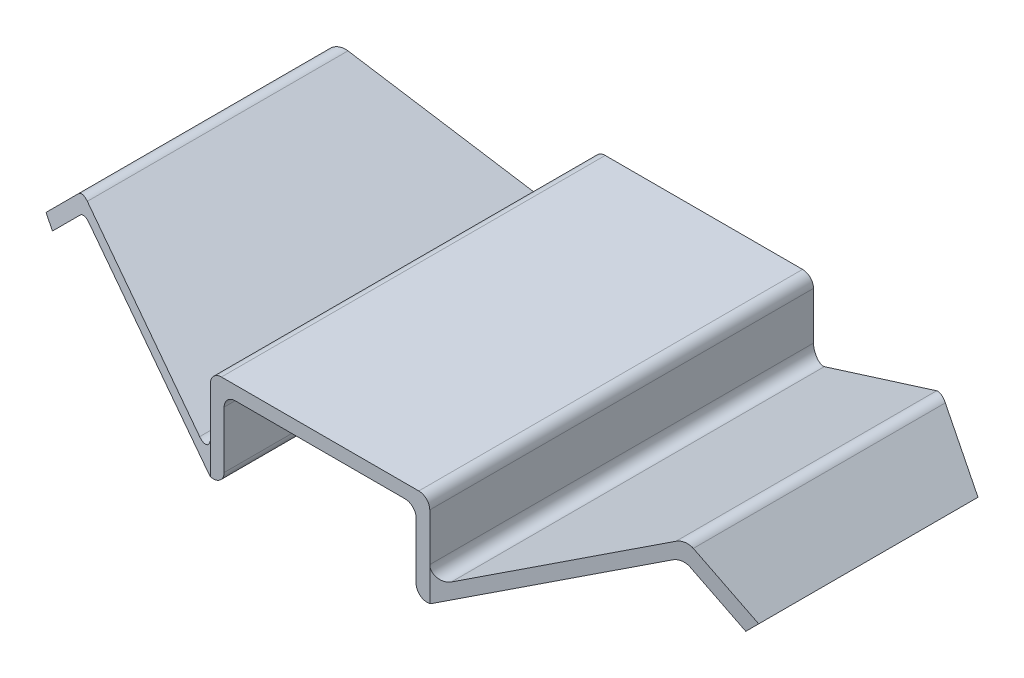
ISO-10303-21;
HEADER;
FILE_DESCRIPTION(('STEP AP214'),'2;1');
FILE_NAME('part.step','',(''),(''),'','','');
FILE_SCHEMA(('AUTOMOTIVE_DESIGN { 1 0 10303 214 1 1 1 1 }'));
ENDSEC;
DATA;
#1=APPLICATION_CONTEXT('core data for automotive mechanical design processes');
#2=APPLICATION_PROTOCOL_DEFINITION('international standard','automotive_design',2000,#1);
#3=PRODUCT_CONTEXT('',#1,'mechanical');
#4=PRODUCT('Part','Part','',(#3));
#5=PRODUCT_RELATED_PRODUCT_CATEGORY('part','',(#4));
#6=PRODUCT_DEFINITION_FORMATION('','',#4);
#7=PRODUCT_DEFINITION_CONTEXT('part definition',#1,'design');
#8=PRODUCT_DEFINITION('design','',#6,#7);
#9=PRODUCT_DEFINITION_SHAPE('','',#8);
#10=(LENGTH_UNIT() NAMED_UNIT(*) SI_UNIT(.MILLI.,.METRE.));
#11=(NAMED_UNIT(*) PLANE_ANGLE_UNIT() SI_UNIT($,.RADIAN.));
#12=(NAMED_UNIT(*) SI_UNIT($,.STERADIAN.) SOLID_ANGLE_UNIT());
#13=UNCERTAINTY_MEASURE_WITH_UNIT(LENGTH_MEASURE(1.E-05),#10,'distance_accuracy_value','');
#14=(GEOMETRIC_REPRESENTATION_CONTEXT(3) GLOBAL_UNCERTAINTY_ASSIGNED_CONTEXT((#13)) GLOBAL_UNIT_ASSIGNED_CONTEXT((#10,
#11,#12)) REPRESENTATION_CONTEXT('',''));
#15=CARTESIAN_POINT('',(0.,0.,0.));
#16=DIRECTION('',(0.,0.,1.));
#17=DIRECTION('',(1.,0.,0.));
#18=AXIS2_PLACEMENT_3D('',#15,#16,#17);
#19=CARTESIAN_POINT('',(0.875,-0.910087912512428,1.75));
#20=DIRECTION('',(-0.477091862904235,0.878853431665694,0.));
#21=DIRECTION('',(-0.878853431665694,-0.477091862904235,0.));
#22=AXIS2_PLACEMENT_3D('',#19,#20,#21);
#23=PLANE('',#22);
#24=DIRECTION('',(-0.843407502480084,-0.457849787060617,0.281135834160028));
#25=VECTOR('',#24,1.);
#26=CARTESIAN_POINT('',(0.884879669656107,-0.904724663270541,1.78837344344796));
#27=LINE('',#26,#25);
#28=CARTESIAN_POINT('',(2.66198723379466,0.0599908715475346,1.19600425540178));
#29=VERTEX_POINT('',#28);
#30=CARTESIAN_POINT('',(1.02270918629042,-0.829902925669055,1.74243027123653));
#31=VERTEX_POINT('',#30);
#32=EDGE_CURVE('E651',#29,#31,#27,.T.);
#33=ORIENTED_EDGE('',*,*,#32,.T.);
#34=DIRECTION('',(0.,0.,-1.));
#35=VECTOR('',#34,1.);
#36=CARTESIAN_POINT('',(1.02270918629042,-0.829902925669055,1.75));
#37=LINE('',#36,#35);
#38=CARTESIAN_POINT('',(1.02270918629042,-0.829902925669055,-1.74243027123653));
#39=VERTEX_POINT('',#38);
#40=EDGE_CURVE('E379',#31,#39,#37,.T.);
#41=ORIENTED_EDGE('',*,*,#40,.T.);
#42=DIRECTION('',(-0.843407502480084,-0.457849787060617,-0.281135834160028));
#43=VECTOR('',#42,1.);
#44=CARTESIAN_POINT('',(1.71477192076908,-0.454211726952068,-1.51174269307697));
#45=LINE('',#44,#43);
#46=CARTESIAN_POINT('',(2.66198723379466,0.0599908715475344,-1.19600425540178));
#47=VERTEX_POINT('',#46);
#48=EDGE_CURVE('E493',#47,#39,#45,.T.);
#49=ORIENTED_EDGE('',*,*,#48,.F.);
#50=DIRECTION('',(0.,0.,-1.));
#51=VECTOR('',#50,1.);
#52=CARTESIAN_POINT('',(2.66198723379466,0.0599908715475346,1.17413029257684));
#53=LINE('',#52,#51);
#54=EDGE_CURVE('E376',#47,#29,#53,.F.);
#55=ORIENTED_EDGE('',*,*,#54,.T.);
#56=EDGE_LOOP('',(#33,#41,#49,#55));
#57=FACE_BOUND('',#56,.T.);
#58=ADVANCED_FACE('F45',(#57),#23,.F.);
#59=CARTESIAN_POINT('',(2.72760912226949,0.0956141824338702,1.75));
#60=DIRECTION('',(0.707106781186548,0.707106781186548,0.));
#61=DIRECTION('',(-0.707106781186548,0.707106781186548,0.));
#62=AXIS2_PLACEMENT_3D('',#59,#60,#61);
#63=PLANE('',#62);
#64=DIRECTION('',(-0.688247201611685,0.688247201611685,0.229415733870562));
#65=VECTOR('',#64,1.);
#66=CARTESIAN_POINT('',(2.63668232636057,0.186540978342791,1.20443922454648));
#67=LINE('',#66,#65);
#68=CARTESIAN_POINT('',(3.16161165235168,-0.338388347648318,1.02946278254944));
#69=VERTEX_POINT('',#68);
#70=CARTESIAN_POINT('',(2.78040709820374,0.0428162064996204,1.15653096726542));
#71=VERTEX_POINT('',#70);
#72=EDGE_CURVE('E257',#69,#71,#67,.T.);
#73=ORIENTED_EDGE('',*,*,#72,.T.);
#74=DIRECTION('',(0.,0.,-1.));
#75=VECTOR('',#74,1.);
#76=CARTESIAN_POINT('',(2.78040709820374,0.0428162064996203,-1.17413029257684));
#77=LINE('',#76,#75);
#78=CARTESIAN_POINT('',(2.78040709820374,0.0428162064996203,-1.15653096726542));
#79=VERTEX_POINT('',#78);
#80=EDGE_CURVE('E414',#71,#79,#77,.T.);
#81=ORIENTED_EDGE('',*,*,#80,.T.);
#82=DIRECTION('',(-0.688247201611685,0.688247201611685,-0.229415733870562));
#83=VECTOR('',#82,1.);
#84=CARTESIAN_POINT('',(3.18931390530794,-0.366090600604578,-1.02022869823069));
#85=LINE('',#84,#83);
#86=CARTESIAN_POINT('',(3.16161165235168,-0.338388347648318,-1.02946278254944));
#87=VERTEX_POINT('',#86);
#88=EDGE_CURVE('E500',#87,#79,#85,.T.);
#89=ORIENTED_EDGE('',*,*,#88,.F.);
#90=DIRECTION('',(0.,0.,-1.));
#91=VECTOR('',#90,1.);
#92=CARTESIAN_POINT('',(3.16161165235168,-0.338388347648318,1.75));
#93=LINE('',#92,#91);
#94=EDGE_CURVE('E266',#69,#87,#93,.T.);
#95=ORIENTED_EDGE('',*,*,#94,.F.);
#96=EDGE_LOOP('',(#73,#81,#89,#95));
#97=FACE_BOUND('',#96,.T.);
#98=ADVANCED_FACE('F669',(#97),#63,.F.);
#99=CARTESIAN_POINT('',(3.16161165235168,-0.338388347648318,1.75));
#100=DIRECTION('',(-0.707106781186547,0.707106781186548,0.));
#101=DIRECTION('',(-0.707106781186548,-0.707106781186547,0.));
#102=AXIS2_PLACEMENT_3D('',#99,#100,#101);
#103=PLANE('',#102);
#104=DIRECTION('',(0.,0.,-1.));
#105=VECTOR('',#104,1.);
#106=CARTESIAN_POINT('',(3.25,-0.249999999999999,1.75));
#107=LINE('',#106,#105);
#108=CARTESIAN_POINT('',(3.25,-0.249999999999999,1.));
#109=VERTEX_POINT('',#108);
#110=CARTESIAN_POINT('',(3.25,-0.249999999999999,-1.));
#111=VERTEX_POINT('',#110);
#112=EDGE_CURVE('E243',#109,#111,#107,.T.);
#113=ORIENTED_EDGE('',*,*,#112,.F.);
#114=DIRECTION('',(-0.688247201611686,-0.688247201611685,0.229415733870562));
#115=VECTOR('',#114,1.);
#116=CARTESIAN_POINT('',(3.04784261801738,-0.452157381982617,1.06738579399421));
#117=LINE('',#116,#115);
#118=EDGE_CURVE('E250',#109,#69,#117,.T.);
#119=ORIENTED_EDGE('',*,*,#118,.T.);
#120=ORIENTED_EDGE('',*,*,#94,.T.);
#121=DIRECTION('',(-0.688247201611686,-0.688247201611685,-0.229415733870562));
#122=VECTOR('',#121,1.);
#123=CARTESIAN_POINT('',(3.60047419696475,0.100474196964752,-0.883175267678416));
#124=LINE('',#123,#122);
#125=EDGE_CURVE('E264',#111,#87,#124,.T.);
#126=ORIENTED_EDGE('',*,*,#125,.F.);
#127=EDGE_LOOP('',(#113,#119,#120,#126));
#128=FACE_BOUND('',#127,.T.);
#129=ADVANCED_FACE('F262',(#128),#103,.F.);
#130=CARTESIAN_POINT('',(2.75,0.250000000000001,1.75));
#131=DIRECTION('',(-0.707106781186547,-0.707106781186548,0.));
#132=DIRECTION('',(0.707106781186548,-0.707106781186547,0.));
#133=AXIS2_PLACEMENT_3D('',#130,#131,#132);
#134=PLANE('',#133);
#135=DIRECTION('',(0.688247201611686,-0.688247201611685,0.229415733870562));
#136=VECTOR('',#135,1.);
#137=CARTESIAN_POINT('',(3.21052631578947,-0.210526315789473,-1.01315789473684));
#138=LINE('',#137,#136);
#139=CARTESIAN_POINT('',(2.80279797593425,0.197202024065751,-1.14906734135525));
#140=VERTEX_POINT('',#139);
#141=EDGE_CURVE('E658',#140,#111,#138,.T.);
#142=ORIENTED_EDGE('',*,*,#141,.F.);
#143=DIRECTION('',(0.,0.,-1.));
#144=VECTOR('',#143,1.);
#145=CARTESIAN_POINT('',(2.80279797593425,0.197202024065751,1.75));
#146=LINE('',#145,#144);
#147=CARTESIAN_POINT('',(2.80279797593425,0.197202024065751,1.14906734135525));
#148=VERTEX_POINT('',#147);
#149=EDGE_CURVE('E246',#140,#148,#146,.F.);
#150=ORIENTED_EDGE('',*,*,#149,.T.);
#151=DIRECTION('',(0.688247201611686,-0.688247201611685,-0.229415733870562));
#152=VECTOR('',#151,1.);
#153=CARTESIAN_POINT('',(2.65789473684211,0.342105263157895,1.19736842105263));
#154=LINE('',#153,#152);
#155=EDGE_CURVE('E238',#148,#109,#154,.T.);
#156=ORIENTED_EDGE('',*,*,#155,.T.);
#157=ORIENTED_EDGE('',*,*,#112,.T.);
#158=EDGE_LOOP('',(#142,#150,#156,#157));
#159=FACE_BOUND('',#158,.T.);
#160=ADVANCED_FACE('F241',(#159),#134,.F.);
#161=CARTESIAN_POINT('',(1.,-0.7,1.75));
#162=DIRECTION('',(0.477091862904234,-0.878853431665694,0.));
#163=DIRECTION('',(0.878853431665694,0.477091862904234,0.));
#164=AXIS2_PLACEMENT_3D('',#161,#162,#163);
#165=PLANE('',#164);
#166=DIRECTION('',(0.843407502480084,0.457849787060617,0.281135834160028));
#167=VECTOR('',#166,1.);
#168=CARTESIAN_POINT('',(1.82989225111298,-0.249487063681527,-1.47336924962901));
#169=LINE('',#168,#167);
#170=CARTESIAN_POINT('',(1.14770918629042,-0.619815013156627,-1.70076360456986));
#171=VERTEX_POINT('',#170);
#172=CARTESIAN_POINT('',(2.68437811152517,0.214376689113665,-1.18854062949161));
#173=VERTEX_POINT('',#172);
#174=EDGE_CURVE('E654',#171,#173,#169,.T.);
#175=ORIENTED_EDGE('',*,*,#174,.F.);
#176=DIRECTION('',(0.,0.,-1.));
#177=VECTOR('',#176,1.);
#178=CARTESIAN_POINT('',(1.14770918629042,-0.619815013156627,1.75));
#179=LINE('',#178,#177);
#180=CARTESIAN_POINT('',(1.14770918629042,-0.619815013156627,1.70076360456986));
#181=VERTEX_POINT('',#180);
#182=EDGE_CURVE('E306',#171,#181,#179,.F.);
#183=ORIENTED_EDGE('',*,*,#182,.T.);
#184=DIRECTION('',(0.843407502480084,0.457849787060617,-0.281135834160028));
#185=VECTOR('',#184,1.);
#186=CARTESIAN_POINT('',(1.,-0.7,1.75));
#187=LINE('',#186,#185);
#188=CARTESIAN_POINT('',(2.68437811152517,0.214376689113665,1.18854062949161));
#189=VERTEX_POINT('',#188);
#190=EDGE_CURVE('E251',#181,#189,#187,.T.);
#191=ORIENTED_EDGE('',*,*,#190,.T.);
#192=DIRECTION('',(0.,0.,-1.));
#193=VECTOR('',#192,1.);
#194=CARTESIAN_POINT('',(2.68437811152517,0.214376689113665,1.75));
#195=LINE('',#194,#193);
#196=EDGE_CURVE('E302',#189,#173,#195,.T.);
#197=ORIENTED_EDGE('',*,*,#196,.T.);
#198=EDGE_LOOP('',(#175,#183,#191,#197));
#199=FACE_BOUND('',#198,.T.);
#200=ADVANCED_FACE('F688',(#199),#165,.F.);
#201=CARTESIAN_POINT('',(0.,0.,-1.75));
#202=DIRECTION('',(0.,0.,1.));
#203=DIRECTION('',(1.,0.,0.));
#204=AXIS2_PLACEMENT_3D('',#201,#202,#203);
#205=PLANE('',#204);
#206=DIRECTION('',(-1.,0.,0.));
#207=VECTOR('',#206,1.);
#208=CARTESIAN_POINT('',(-1.,0.,-1.75));
#209=LINE('',#208,#207);
#210=CARTESIAN_POINT('',(0.9,0.,-1.75));
#211=VERTEX_POINT('',#210);
#212=CARTESIAN_POINT('',(-0.9,0.,-1.75));
#213=VERTEX_POINT('',#212);
#214=EDGE_CURVE('E277',#211,#213,#209,.T.);
#215=ORIENTED_EDGE('',*,*,#214,.F.);
#216=CARTESIAN_POINT('',(0.9,-0.0999999999999998,-1.75));
#217=DIRECTION('',(0.,0.,1.));
#218=DIRECTION('',(1.,0.,0.));
#219=AXIS2_PLACEMENT_3D('',#216,#217,#218);
#220=CIRCLE('',#219,0.1);
#221=CARTESIAN_POINT('',(1.,-0.0999999999999998,-1.75));
#222=VERTEX_POINT('',#221);
#223=EDGE_CURVE('E340',#211,#222,#220,.F.);
#224=ORIENTED_EDGE('',*,*,#223,.T.);
#225=DIRECTION('',(0.,1.,0.));
#226=VECTOR('',#225,1.);
#227=CARTESIAN_POINT('',(1.,0.,-1.75));
#228=LINE('',#227,#226);
#229=CARTESIAN_POINT('',(1.,-0.531929669990057,-1.75));
#230=VERTEX_POINT('',#229);
#231=EDGE_CURVE('E557',#230,#222,#228,.T.);
#232=ORIENTED_EDGE('',*,*,#231,.F.);
#233=DIRECTION('',(0.,1.,0.));
#234=VECTOR('',#233,1.);
#235=CARTESIAN_POINT('',(1.,0.,-1.75));
#236=LINE('',#235,#234);
#237=CARTESIAN_POINT('',(1.,-0.838842166157671,-1.75));
#238=VERTEX_POINT('',#237);
#239=EDGE_CURVE('E292',#238,#230,#236,.T.);
#240=ORIENTED_EDGE('',*,*,#239,.F.);
#241=CARTESIAN_POINT('',(0.975,-0.742017582502486,-1.75));
#242=DIRECTION('',(0.,0.,1.));
#243=DIRECTION('',(1.,0.,0.));
#244=AXIS2_PLACEMENT_3D('',#241,#242,#243);
#245=CIRCLE('',#244,0.1);
#246=CARTESIAN_POINT('',(0.875,-0.742017582502486,-1.75));
#247=VERTEX_POINT('',#246);
#248=EDGE_CURVE('E334',#238,#247,#245,.F.);
#249=ORIENTED_EDGE('',*,*,#248,.T.);
#250=DIRECTION('',(0.,-1.,0.));
#251=VECTOR('',#250,1.);
#252=CARTESIAN_POINT('',(0.875,-0.125,-1.75));
#253=LINE('',#252,#251);
#254=CARTESIAN_POINT('',(0.875,-0.225,-1.75));
#255=VERTEX_POINT('',#254);
#256=EDGE_CURVE('E554',#255,#247,#253,.T.);
#257=ORIENTED_EDGE('',*,*,#256,.F.);
#258=CARTESIAN_POINT('',(0.775,-0.225,-1.75));
#259=DIRECTION('',(0.,0.,1.));
#260=DIRECTION('',(1.,0.,0.));
#261=AXIS2_PLACEMENT_3D('',#258,#259,#260);
#262=CIRCLE('',#261,0.1);
#263=CARTESIAN_POINT('',(0.775,-0.125,-1.75));
#264=VERTEX_POINT('',#263);
#265=EDGE_CURVE('E441',#255,#264,#262,.T.);
#266=ORIENTED_EDGE('',*,*,#265,.T.);
#267=DIRECTION('',(1.,0.,0.));
#268=VECTOR('',#267,1.);
#269=CARTESIAN_POINT('',(-0.875,-0.125,-1.75));
#270=LINE('',#269,#268);
#271=CARTESIAN_POINT('',(-0.775,-0.125,-1.75));
#272=VERTEX_POINT('',#271);
#273=EDGE_CURVE('E550',#272,#264,#270,.T.);
#274=ORIENTED_EDGE('',*,*,#273,.F.);
#275=CARTESIAN_POINT('',(-0.775,-0.225,-1.75));
#276=DIRECTION('',(0.,0.,1.));
#277=DIRECTION('',(1.,0.,0.));
#278=AXIS2_PLACEMENT_3D('',#275,#276,#277);
#279=CIRCLE('',#278,0.1);
#280=CARTESIAN_POINT('',(-0.875,-0.225,-1.75));
#281=VERTEX_POINT('',#280);
#282=EDGE_CURVE('E447',#272,#281,#279,.T.);
#283=ORIENTED_EDGE('',*,*,#282,.T.);
#284=DIRECTION('',(0.,1.,0.));
#285=VECTOR('',#284,1.);
#286=CARTESIAN_POINT('',(-0.875,-0.125,-1.75));
#287=LINE('',#286,#285);
#288=CARTESIAN_POINT('',(-0.875,-0.742017582502486,-1.75));
#289=VERTEX_POINT('',#288);
#290=EDGE_CURVE('E546',#289,#281,#287,.T.);
#291=ORIENTED_EDGE('',*,*,#290,.F.);
#292=CARTESIAN_POINT('',(-0.975,-0.742017582502486,-1.75));
#293=DIRECTION('',(0.,0.,1.));
#294=DIRECTION('',(1.,0.,0.));
#295=AXIS2_PLACEMENT_3D('',#292,#293,#294);
#296=CIRCLE('',#295,0.1);
#297=CARTESIAN_POINT('',(-1.,-0.83884216615767,-1.75));
#298=VERTEX_POINT('',#297);
#299=EDGE_CURVE('E331',#289,#298,#296,.F.);
#300=ORIENTED_EDGE('',*,*,#299,.T.);
#301=DIRECTION('',(0.,1.,0.));
#302=VECTOR('',#301,1.);
#303=CARTESIAN_POINT('',(-1.,0.,-1.75));
#304=LINE('',#303,#302);
#305=CARTESIAN_POINT('',(-1.,-0.531929669990058,-1.75));
#306=VERTEX_POINT('',#305);
#307=EDGE_CURVE('E62',#298,#306,#304,.T.);
#308=ORIENTED_EDGE('',*,*,#307,.T.);
#309=DIRECTION('',(0.,-1.,0.));
#310=VECTOR('',#309,1.);
#311=CARTESIAN_POINT('',(-1.,0.,-1.75));
#312=LINE('',#311,#310);
#313=CARTESIAN_POINT('',(-1.,-0.1,-1.75));
#314=VERTEX_POINT('',#313);
#315=EDGE_CURVE('E524',#314,#306,#312,.T.);
#316=ORIENTED_EDGE('',*,*,#315,.F.);
#317=CARTESIAN_POINT('',(-0.9,-0.1,-1.75));
#318=DIRECTION('',(0.,0.,1.));
#319=DIRECTION('',(1.,0.,0.));
#320=AXIS2_PLACEMENT_3D('',#317,#318,#319);
#321=CIRCLE('',#320,0.1);
#322=EDGE_CURVE('E337',#314,#213,#321,.F.);
#323=ORIENTED_EDGE('',*,*,#322,.T.);
#324=EDGE_LOOP('',(#215,#224,#232,#240,#249,#257,#266,#274,#283,#291,#300,#308,#316,#323));
#325=FACE_BOUND('',#324,.T.);
#326=ADVANCED_FACE('F678',(#325),#205,.F.);
#327=CARTESIAN_POINT('',(-1.,-0.7,1.75));
#328=DIRECTION('',(-0.477091862904234,-0.878853431665694,0.));
#329=DIRECTION('',(0.878853431665694,-0.477091862904234,0.));
#330=AXIS2_PLACEMENT_3D('',#327,#328,#329);
#331=PLANE('',#330);
#332=DIRECTION('',(-0.843407502480084,0.457849787060617,-0.281135834160028));
#333=VECTOR('',#332,1.);
#334=CARTESIAN_POINT('',(-1.,-0.7,1.75));
#335=LINE('',#334,#333);
#336=CARTESIAN_POINT('',(-1.14770918629042,-0.619815013156627,1.70076360456986));
#337=VERTEX_POINT('',#336);
#338=CARTESIAN_POINT('',(-2.68437811152517,0.214376689113665,1.18854062949161));
#339=VERTEX_POINT('',#338);
#340=EDGE_CURVE('E509',#337,#339,#335,.T.);
#341=ORIENTED_EDGE('',*,*,#340,.F.);
#342=DIRECTION('',(0.,0.,-1.));
#343=VECTOR('',#342,1.);
#344=CARTESIAN_POINT('',(-1.14770918629042,-0.619815013156627,-1.75));
#345=LINE('',#344,#343);
#346=CARTESIAN_POINT('',(-1.14770918629042,-0.619815013156627,-1.70076360456986));
#347=VERTEX_POINT('',#346);
#348=EDGE_CURVE('E312',#337,#347,#345,.T.);
#349=ORIENTED_EDGE('',*,*,#348,.T.);
#350=DIRECTION('',(-0.843407502480084,0.457849787060617,0.281135834160028));
#351=VECTOR('',#350,1.);
#352=CARTESIAN_POINT('',(-1.82989225111298,-0.249487063681528,-1.47336924962901));
#353=LINE('',#352,#351);
#354=CARTESIAN_POINT('',(-2.68437811152517,0.214376689113665,-1.18854062949161));
#355=VERTEX_POINT('',#354);
#356=EDGE_CURVE('E520',#347,#355,#353,.T.);
#357=ORIENTED_EDGE('',*,*,#356,.T.);
#358=DIRECTION('',(0.,0.,-1.));
#359=VECTOR('',#358,1.);
#360=CARTESIAN_POINT('',(-2.68437811152517,0.214376689113665,1.75));
#361=LINE('',#360,#359);
#362=EDGE_CURVE('E309',#355,#339,#361,.F.);
#363=ORIENTED_EDGE('',*,*,#362,.T.);
#364=EDGE_LOOP('',(#341,#349,#357,#363));
#365=FACE_BOUND('',#364,.T.);
#366=ADVANCED_FACE('F589',(#365),#331,.F.);
#367=CARTESIAN_POINT('',(-2.75,0.25,1.75));
#368=DIRECTION('',(0.707106781186547,-0.707106781186547,0.));
#369=DIRECTION('',(0.707106781186548,0.707106781186548,0.));
#370=AXIS2_PLACEMENT_3D('',#367,#368,#369);
#371=PLANE('',#370);
#372=DIRECTION('',(-0.688247201611685,-0.688247201611685,-0.229415733870562));
#373=VECTOR('',#372,1.);
#374=CARTESIAN_POINT('',(-2.65789473684211,0.342105263157895,1.19736842105263));
#375=LINE('',#374,#373);
#376=CARTESIAN_POINT('',(-2.80279797593425,0.19720202406575,1.14906734135525));
#377=VERTEX_POINT('',#376);
#378=CARTESIAN_POINT('',(-3.25,-0.25,1.));
#379=VERTEX_POINT('',#378);
#380=EDGE_CURVE('E506',#377,#379,#375,.T.);
#381=ORIENTED_EDGE('',*,*,#380,.F.);
#382=DIRECTION('',(0.,0.,-1.));
#383=VECTOR('',#382,1.);
#384=CARTESIAN_POINT('',(-2.80279797593425,0.19720202406575,1.75));
#385=LINE('',#384,#383);
#386=CARTESIAN_POINT('',(-2.80279797593425,0.19720202406575,-1.14906734135525));
#387=VERTEX_POINT('',#386);
#388=EDGE_CURVE('E423',#377,#387,#385,.T.);
#389=ORIENTED_EDGE('',*,*,#388,.T.);
#390=DIRECTION('',(-0.688247201611685,-0.688247201611685,0.229415733870562));
#391=VECTOR('',#390,1.);
#392=CARTESIAN_POINT('',(-3.21052631578947,-0.210526315789474,-1.01315789473684));
#393=LINE('',#392,#391);
#394=CARTESIAN_POINT('',(-3.25,-0.250000000000001,-1.));
#395=VERTEX_POINT('',#394);
#396=EDGE_CURVE('E517',#387,#395,#393,.T.);
#397=ORIENTED_EDGE('',*,*,#396,.T.);
#398=DIRECTION('',(0.,0.,-1.));
#399=VECTOR('',#398,1.);
#400=CARTESIAN_POINT('',(-3.25,-0.25,1.75));
#401=LINE('',#400,#399);
#402=EDGE_CURVE('E282',#379,#395,#401,.T.);
#403=ORIENTED_EDGE('',*,*,#402,.F.);
#404=EDGE_LOOP('',(#381,#389,#397,#403));
#405=FACE_BOUND('',#404,.T.);
#406=ADVANCED_FACE('F598',(#405),#371,.F.);
#407=CARTESIAN_POINT('',(-3.25,-0.25,1.75));
#408=DIRECTION('',(0.707106781186546,0.707106781186549,0.));
#409=DIRECTION('',(-0.707106781186549,0.707106781186546,0.));
#410=AXIS2_PLACEMENT_3D('',#407,#408,#409);
#411=PLANE('',#410);
#412=DIRECTION('',(0.688247201611687,-0.688247201611684,0.229415733870562));
#413=VECTOR('',#412,1.);
#414=CARTESIAN_POINT('',(-3.13157894736842,-0.368421052631579,1.03947368421053));
#415=LINE('',#414,#413);
#416=CARTESIAN_POINT('',(-3.16161165235168,-0.338388347648318,1.02946278254944));
#417=VERTEX_POINT('',#416);
#418=EDGE_CURVE('E497',#379,#417,#415,.T.);
#419=ORIENTED_EDGE('',*,*,#418,.F.);
#420=ORIENTED_EDGE('',*,*,#402,.T.);
#421=DIRECTION('',(0.688247201611687,-0.688247201611684,-0.229415733870562));
#422=VECTOR('',#421,1.);
#423=CARTESIAN_POINT('',(-3.68421052631579,0.18421052631579,-0.855263157894736));
#424=LINE('',#423,#422);
#425=CARTESIAN_POINT('',(-3.16161165235168,-0.338388347648318,-1.02946278254944));
#426=VERTEX_POINT('',#425);
#427=EDGE_CURVE('E478',#395,#426,#424,.T.);
#428=ORIENTED_EDGE('',*,*,#427,.T.);
#429=DIRECTION('',(0.,0.,-1.));
#430=VECTOR('',#429,1.);
#431=CARTESIAN_POINT('',(-3.16161165235168,-0.338388347648318,1.75));
#432=LINE('',#431,#430);
#433=EDGE_CURVE('E271',#417,#426,#432,.T.);
#434=ORIENTED_EDGE('',*,*,#433,.F.);
#435=EDGE_LOOP('',(#419,#420,#428,#434));
#436=FACE_BOUND('',#435,.T.);
#437=ADVANCED_FACE('F601',(#436),#411,.F.);
#438=CARTESIAN_POINT('',(-2.72760912226949,0.0956141824338692,1.75));
#439=DIRECTION('',(-0.707106781186548,0.707106781186548,0.));
#440=DIRECTION('',(-0.707106781186548,-0.707106781186547,0.));
#441=AXIS2_PLACEMENT_3D('',#438,#439,#440);
#442=PLANE('',#441);
#443=DIRECTION('',(0.688247201611685,0.688247201611685,-0.229415733870562));
#444=VECTOR('',#443,1.);
#445=CARTESIAN_POINT('',(-3.18931390530794,-0.366090600604579,-1.02022869823069));
#446=LINE('',#445,#444);
#447=CARTESIAN_POINT('',(-2.78040709820374,0.0428162064996192,-1.15653096726542));
#448=VERTEX_POINT('',#447);
#449=EDGE_CURVE('E465',#426,#448,#446,.T.);
#450=ORIENTED_EDGE('',*,*,#449,.T.);
#451=DIRECTION('',(0.,0.,-1.));
#452=VECTOR('',#451,1.);
#453=CARTESIAN_POINT('',(-2.78040709820374,0.0428162064996193,1.17413029257684));
#454=LINE('',#453,#452);
#455=CARTESIAN_POINT('',(-2.78040709820374,0.0428162064996193,1.15653096726542));
#456=VERTEX_POINT('',#455);
#457=EDGE_CURVE('E418',#448,#456,#454,.F.);
#458=ORIENTED_EDGE('',*,*,#457,.T.);
#459=DIRECTION('',(0.688247201611685,0.688247201611685,0.229415733870562));
#460=VECTOR('',#459,1.);
#461=CARTESIAN_POINT('',(-2.63668232636057,0.18654097834279,1.20443922454648));
#462=LINE('',#461,#460);
#463=EDGE_CURVE('E488',#417,#456,#462,.T.);
#464=ORIENTED_EDGE('',*,*,#463,.F.);
#465=ORIENTED_EDGE('',*,*,#433,.T.);
#466=EDGE_LOOP('',(#450,#458,#464,#465));
#467=FACE_BOUND('',#466,.T.);
#468=ADVANCED_FACE('F473',(#467),#442,.F.);
#469=CARTESIAN_POINT('',(-0.875,-0.910087912512428,1.75));
#470=DIRECTION('',(0.477091862904234,0.878853431665694,0.));
#471=DIRECTION('',(-0.878853431665694,0.477091862904234,0.));
#472=AXIS2_PLACEMENT_3D('',#469,#470,#471);
#473=PLANE('',#472);
#474=DIRECTION('',(0.843407502480084,-0.457849787060617,-0.281135834160028));
#475=VECTOR('',#474,1.);
#476=CARTESIAN_POINT('',(-1.71477192076908,-0.454211726952069,-1.51174269307697));
#477=LINE('',#476,#475);
#478=CARTESIAN_POINT('',(-2.66198723379467,0.0599908715475337,-1.19600425540178));
#479=VERTEX_POINT('',#478);
#480=CARTESIAN_POINT('',(-1.02270918629042,-0.829902925669055,-1.74243027123653));
#481=VERTEX_POINT('',#480);
#482=EDGE_CURVE('E468',#479,#481,#477,.T.);
#483=ORIENTED_EDGE('',*,*,#482,.T.);
#484=DIRECTION('',(0.,0.,-1.));
#485=VECTOR('',#484,1.);
#486=CARTESIAN_POINT('',(-1.02270918629042,-0.829902925669055,1.75));
#487=LINE('',#486,#485);
#488=CARTESIAN_POINT('',(-1.02270918629042,-0.829902925669055,1.74243027123653));
#489=VERTEX_POINT('',#488);
#490=EDGE_CURVE('E405',#481,#489,#487,.F.);
#491=ORIENTED_EDGE('',*,*,#490,.T.);
#492=DIRECTION('',(0.843407502480084,-0.457849787060617,0.281135834160028));
#493=VECTOR('',#492,1.);
#494=CARTESIAN_POINT('',(-0.884879669656107,-0.904724663270541,1.78837344344796));
#495=LINE('',#494,#493);
#496=CARTESIAN_POINT('',(-2.66198723379466,0.0599908715475336,1.19600425540178));
#497=VERTEX_POINT('',#496);
#498=EDGE_CURVE('E486',#497,#489,#495,.T.);
#499=ORIENTED_EDGE('',*,*,#498,.F.);
#500=DIRECTION('',(0.,0.,-1.));
#501=VECTOR('',#500,1.);
#502=CARTESIAN_POINT('',(-2.66198723379467,0.0599908715475337,-1.17413029257683));
#503=LINE('',#502,#501);
#504=EDGE_CURVE('E401',#497,#479,#503,.T.);
#505=ORIENTED_EDGE('',*,*,#504,.T.);
#506=EDGE_LOOP('',(#483,#491,#499,#505));
#507=FACE_BOUND('',#506,.T.);
#508=ADVANCED_FACE('F490',(#507),#473,.F.);
#509=CARTESIAN_POINT('',(0.,0.,1.75));
#510=DIRECTION('',(0.,0.,1.));
#511=DIRECTION('',(1.,0.,0.));
#512=AXIS2_PLACEMENT_3D('',#509,#510,#511);
#513=PLANE('',#512);
#514=DIRECTION('',(0.,1.,0.));
#515=VECTOR('',#514,1.);
#516=CARTESIAN_POINT('',(1.,0.,1.75));
#517=LINE('',#516,#515);
#518=CARTESIAN_POINT('',(1.,-0.531929669990057,1.75));
#519=VERTEX_POINT('',#518);
#520=CARTESIAN_POINT('',(1.,-0.0999999999999998,1.75));
#521=VERTEX_POINT('',#520);
#522=EDGE_CURVE('E274',#519,#521,#517,.T.);
#523=ORIENTED_EDGE('',*,*,#522,.T.);
#524=CARTESIAN_POINT('',(0.9,-0.0999999999999998,1.75));
#525=DIRECTION('',(0.,0.,1.));
#526=DIRECTION('',(1.,0.,0.));
#527=AXIS2_PLACEMENT_3D('',#524,#525,#526);
#528=CIRCLE('',#527,0.1);
#529=CARTESIAN_POINT('',(0.9,0.,1.75));
#530=VERTEX_POINT('',#529);
#531=EDGE_CURVE('E352',#521,#530,#528,.T.);
#532=ORIENTED_EDGE('',*,*,#531,.T.);
#533=DIRECTION('',(-1.,0.,0.));
#534=VECTOR('',#533,1.);
#535=CARTESIAN_POINT('',(-1.,0.,1.75));
#536=LINE('',#535,#534);
#537=CARTESIAN_POINT('',(-0.9,0.,1.75));
#538=VERTEX_POINT('',#537);
#539=EDGE_CURVE('E267',#530,#538,#536,.T.);
#540=ORIENTED_EDGE('',*,*,#539,.T.);
#541=CARTESIAN_POINT('',(-0.9,-0.1,1.75));
#542=DIRECTION('',(0.,0.,1.));
#543=DIRECTION('',(1.,0.,0.));
#544=AXIS2_PLACEMENT_3D('',#541,#542,#543);
#545=CIRCLE('',#544,0.1);
#546=CARTESIAN_POINT('',(-1.,-0.1,1.75));
#547=VERTEX_POINT('',#546);
#548=EDGE_CURVE('E349',#538,#547,#545,.T.);
#549=ORIENTED_EDGE('',*,*,#548,.T.);
#550=DIRECTION('',(0.,-1.,0.));
#551=VECTOR('',#550,1.);
#552=CARTESIAN_POINT('',(-1.,0.,1.75));
#553=LINE('',#552,#551);
#554=CARTESIAN_POINT('',(-1.,-0.531929669990058,1.75));
#555=VERTEX_POINT('',#554);
#556=EDGE_CURVE('E525',#547,#555,#553,.T.);
#557=ORIENTED_EDGE('',*,*,#556,.T.);
#558=DIRECTION('',(0.,-1.,0.));
#559=VECTOR('',#558,1.);
#560=CARTESIAN_POINT('',(-1.,0.,1.75));
#561=LINE('',#560,#559);
#562=CARTESIAN_POINT('',(-1.,-0.83884216615767,1.75));
#563=VERTEX_POINT('',#562);
#564=EDGE_CURVE('E288',#555,#563,#561,.T.);
#565=ORIENTED_EDGE('',*,*,#564,.T.);
#566=CARTESIAN_POINT('',(-0.975,-0.742017582502486,1.75));
#567=DIRECTION('',(0.,0.,1.));
#568=DIRECTION('',(1.,0.,0.));
#569=AXIS2_PLACEMENT_3D('',#566,#567,#568);
#570=CIRCLE('',#569,0.1);
#571=CARTESIAN_POINT('',(-0.875,-0.742017582502486,1.75));
#572=VERTEX_POINT('',#571);
#573=EDGE_CURVE('E343',#563,#572,#570,.T.);
#574=ORIENTED_EDGE('',*,*,#573,.T.);
#575=DIRECTION('',(0.,1.,0.));
#576=VECTOR('',#575,1.);
#577=CARTESIAN_POINT('',(-0.875,-0.125,1.75));
#578=LINE('',#577,#576);
#579=CARTESIAN_POINT('',(-0.875,-0.225,1.75));
#580=VERTEX_POINT('',#579);
#581=EDGE_CURVE('E529',#572,#580,#578,.T.);
#582=ORIENTED_EDGE('',*,*,#581,.T.);
#583=CARTESIAN_POINT('',(-0.775,-0.225,1.75));
#584=DIRECTION('',(0.,0.,1.));
#585=DIRECTION('',(1.,0.,0.));
#586=AXIS2_PLACEMENT_3D('',#583,#584,#585);
#587=CIRCLE('',#586,0.1);
#588=CARTESIAN_POINT('',(-0.775,-0.125,1.75));
#589=VERTEX_POINT('',#588);
#590=EDGE_CURVE('E450',#580,#589,#587,.F.);
#591=ORIENTED_EDGE('',*,*,#590,.T.);
#592=DIRECTION('',(1.,0.,0.));
#593=VECTOR('',#592,1.);
#594=CARTESIAN_POINT('',(-0.875,-0.125,1.75));
#595=LINE('',#594,#593);
#596=CARTESIAN_POINT('',(0.775,-0.125,1.75));
#597=VERTEX_POINT('',#596);
#598=EDGE_CURVE('E533',#589,#597,#595,.T.);
#599=ORIENTED_EDGE('',*,*,#598,.T.);
#600=CARTESIAN_POINT('',(0.775,-0.225,1.75));
#601=DIRECTION('',(0.,0.,1.));
#602=DIRECTION('',(1.,0.,0.));
#603=AXIS2_PLACEMENT_3D('',#600,#601,#602);
#604=CIRCLE('',#603,0.1);
#605=CARTESIAN_POINT('',(0.875,-0.225,1.75));
#606=VERTEX_POINT('',#605);
#607=EDGE_CURVE('E444',#597,#606,#604,.F.);
#608=ORIENTED_EDGE('',*,*,#607,.T.);
#609=DIRECTION('',(0.,-1.,0.));
#610=VECTOR('',#609,1.);
#611=CARTESIAN_POINT('',(0.875,-0.125,1.75));
#612=LINE('',#611,#610);
#613=CARTESIAN_POINT('',(0.875,-0.742017582502486,1.75));
#614=VERTEX_POINT('',#613);
#615=EDGE_CURVE('E537',#606,#614,#612,.T.);
#616=ORIENTED_EDGE('',*,*,#615,.T.);
#617=CARTESIAN_POINT('',(0.975,-0.742017582502486,1.75));
#618=DIRECTION('',(0.,0.,1.));
#619=DIRECTION('',(1.,0.,0.));
#620=AXIS2_PLACEMENT_3D('',#617,#618,#619);
#621=CIRCLE('',#620,0.1);
#622=CARTESIAN_POINT('',(1.,-0.838842166157671,1.75));
#623=VERTEX_POINT('',#622);
#624=EDGE_CURVE('E346',#614,#623,#621,.T.);
#625=ORIENTED_EDGE('',*,*,#624,.T.);
#626=DIRECTION('',(0.,1.,0.));
#627=VECTOR('',#626,1.);
#628=CARTESIAN_POINT('',(1.,-0.910087912512428,1.75));
#629=LINE('',#628,#627);
#630=EDGE_CURVE('E636',#623,#519,#629,.T.);
#631=ORIENTED_EDGE('',*,*,#630,.T.);
#632=EDGE_LOOP('',(#523,#532,#540,#549,#557,#565,#574,#582,#591,#599,#608,#616,#625,#631));
#633=FACE_BOUND('',#632,.T.);
#634=ADVANCED_FACE('F577',(#633),#513,.T.);
#635=CARTESIAN_POINT('',(-1.,0.,1.75));
#636=DIRECTION('',(1.,0.,0.));
#637=DIRECTION('',(0.,0.,-1.));
#638=AXIS2_PLACEMENT_3D('',#635,#636,#637);
#639=PLANE('',#638);
#640=ORIENTED_EDGE('',*,*,#315,.T.);
#641=DIRECTION('',(0.,0.,-1.));
#642=VECTOR('',#641,1.);
#643=CARTESIAN_POINT('',(-1.,-0.531929669990058,1.75));
#644=LINE('',#643,#642);
#645=EDGE_CURVE('E320',#306,#555,#644,.F.);
#646=ORIENTED_EDGE('',*,*,#645,.T.);
#647=ORIENTED_EDGE('',*,*,#556,.F.);
#648=DIRECTION('',(0.,0.,-1.));
#649=VECTOR('',#648,1.);
#650=CARTESIAN_POINT('',(-1.,-0.1,1.75));
#651=LINE('',#650,#649);
#652=EDGE_CURVE('E316',#547,#314,#651,.T.);
#653=ORIENTED_EDGE('',*,*,#652,.T.);
#654=EDGE_LOOP('',(#640,#646,#647,#653));
#655=FACE_BOUND('',#654,.T.);
#656=ADVANCED_FACE('F580',(#655),#639,.F.);
#657=CARTESIAN_POINT('',(-0.875,-0.125,1.75));
#658=DIRECTION('',(-1.,0.,0.));
#659=DIRECTION('',(0.,-1.,0.));
#660=AXIS2_PLACEMENT_3D('',#657,#658,#659);
#661=PLANE('',#660);
#662=ORIENTED_EDGE('',*,*,#290,.T.);
#663=DIRECTION('',(0.,0.,-1.));
#664=VECTOR('',#663,1.);
#665=CARTESIAN_POINT('',(-0.875,-0.225,1.75));
#666=LINE('',#665,#664);
#667=EDGE_CURVE('E373',#281,#580,#666,.F.);
#668=ORIENTED_EDGE('',*,*,#667,.T.);
#669=ORIENTED_EDGE('',*,*,#581,.F.);
#670=DIRECTION('',(0.,0.,-1.));
#671=VECTOR('',#670,1.);
#672=CARTESIAN_POINT('',(-0.875,-0.742017582502486,1.75));
#673=LINE('',#672,#671);
#674=EDGE_CURVE('E369',#572,#289,#673,.T.);
#675=ORIENTED_EDGE('',*,*,#674,.T.);
#676=EDGE_LOOP('',(#662,#668,#669,#675));
#677=FACE_BOUND('',#676,.T.);
#678=ADVANCED_FACE('F610',(#677),#661,.F.);
#679=CARTESIAN_POINT('',(-0.875,-0.125,1.75));
#680=DIRECTION('',(0.,1.,0.));
#681=DIRECTION('',(0.,0.,1.));
#682=AXIS2_PLACEMENT_3D('',#679,#680,#681);
#683=PLANE('',#682);
#684=ORIENTED_EDGE('',*,*,#273,.T.);
#685=DIRECTION('',(0.,0.,-1.));
#686=VECTOR('',#685,1.);
#687=CARTESIAN_POINT('',(0.775,-0.125,1.75));
#688=LINE('',#687,#686);
#689=EDGE_CURVE('E366',#264,#597,#688,.F.);
#690=ORIENTED_EDGE('',*,*,#689,.T.);
#691=ORIENTED_EDGE('',*,*,#598,.F.);
#692=DIRECTION('',(0.,0.,-1.));
#693=VECTOR('',#692,1.);
#694=CARTESIAN_POINT('',(-0.775,-0.125,-1.75));
#695=LINE('',#694,#693);
#696=EDGE_CURVE('E362',#589,#272,#695,.T.);
#697=ORIENTED_EDGE('',*,*,#696,.T.);
#698=EDGE_LOOP('',(#684,#690,#691,#697));
#699=FACE_BOUND('',#698,.T.);
#700=ADVANCED_FACE('F619',(#699),#683,.F.);
#701=CARTESIAN_POINT('',(0.875,-0.125,1.75));
#702=DIRECTION('',(1.,0.,0.));
#703=DIRECTION('',(0.,1.,0.));
#704=AXIS2_PLACEMENT_3D('',#701,#702,#703);
#705=PLANE('',#704);
#706=ORIENTED_EDGE('',*,*,#615,.F.);
#707=DIRECTION('',(0.,0.,-1.));
#708=VECTOR('',#707,1.);
#709=CARTESIAN_POINT('',(0.875,-0.225,-1.75));
#710=LINE('',#709,#708);
#711=EDGE_CURVE('E358',#606,#255,#710,.T.);
#712=ORIENTED_EDGE('',*,*,#711,.T.);
#713=ORIENTED_EDGE('',*,*,#256,.T.);
#714=DIRECTION('',(0.,0.,-1.));
#715=VECTOR('',#714,1.);
#716=CARTESIAN_POINT('',(0.875,-0.742017582502486,1.75));
#717=LINE('',#716,#715);
#718=EDGE_CURVE('E355',#247,#614,#717,.F.);
#719=ORIENTED_EDGE('',*,*,#718,.T.);
#720=EDGE_LOOP('',(#706,#712,#713,#719));
#721=FACE_BOUND('',#720,.T.);
#722=ADVANCED_FACE('F628',(#721),#705,.F.);
#723=CARTESIAN_POINT('',(1.,0.,1.75));
#724=DIRECTION('',(-1.,0.,0.));
#725=DIRECTION('',(0.,0.,1.));
#726=AXIS2_PLACEMENT_3D('',#723,#724,#725);
#727=PLANE('',#726);
#728=ORIENTED_EDGE('',*,*,#522,.F.);
#729=DIRECTION('',(0.,0.,-1.));
#730=VECTOR('',#729,1.);
#731=CARTESIAN_POINT('',(1.,-0.531929669990057,-1.75));
#732=LINE('',#731,#730);
#733=EDGE_CURVE('E298',#519,#230,#732,.T.);
#734=ORIENTED_EDGE('',*,*,#733,.T.);
#735=ORIENTED_EDGE('',*,*,#231,.T.);
#736=DIRECTION('',(0.,0.,-1.));
#737=VECTOR('',#736,1.);
#738=CARTESIAN_POINT('',(1.,-0.0999999999999998,1.75));
#739=LINE('',#738,#737);
#740=EDGE_CURVE('E295',#222,#521,#739,.F.);
#741=ORIENTED_EDGE('',*,*,#740,.T.);
#742=EDGE_LOOP('',(#728,#734,#735,#741));
#743=FACE_BOUND('',#742,.T.);
#744=ADVANCED_FACE('F682',(#743),#727,.F.);
#745=CARTESIAN_POINT('',(-1.,0.,1.75));
#746=DIRECTION('',(0.,-1.,0.));
#747=DIRECTION('',(1.,0.,0.));
#748=AXIS2_PLACEMENT_3D('',#745,#746,#747);
#749=PLANE('',#748);
#750=ORIENTED_EDGE('',*,*,#539,.F.);
#751=DIRECTION('',(0.,0.,-1.));
#752=VECTOR('',#751,1.);
#753=CARTESIAN_POINT('',(0.9,0.,1.75));
#754=LINE('',#753,#752);
#755=EDGE_CURVE('E327',#530,#211,#754,.T.);
#756=ORIENTED_EDGE('',*,*,#755,.T.);
#757=ORIENTED_EDGE('',*,*,#214,.T.);
#758=DIRECTION('',(0.,0.,-1.));
#759=VECTOR('',#758,1.);
#760=CARTESIAN_POINT('',(-0.9,0.,1.75));
#761=LINE('',#760,#759);
#762=EDGE_CURVE('E324',#213,#538,#761,.F.);
#763=ORIENTED_EDGE('',*,*,#762,.T.);
#764=EDGE_LOOP('',(#750,#756,#757,#763));
#765=FACE_BOUND('',#764,.T.);
#766=ADVANCED_FACE('F569',(#765),#749,.F.);
#767=CARTESIAN_POINT('',(-3.25,-0.910087912512428,-1.));
#768=DIRECTION('',(0.316227766016838,0.,0.948683298050514));
#769=DIRECTION('',(0.948683298050514,0.,-0.316227766016838));
#770=AXIS2_PLACEMENT_3D('',#767,#768,#769);
#771=PLANE('',#770);
#772=ORIENTED_EDGE('',*,*,#307,.F.);
#773=CARTESIAN_POINT('',(-0.975,-0.742017582502486,-1.75833333333333));
#774=DIRECTION('',(0.316227766016838,0.,0.948683298050514));
#775=DIRECTION('',(0.948683298050514,0.,-0.316227766016838));
#776=AXIS2_PLACEMENT_3D('',#773,#774,#775);
#777=ELLIPSE('',#776,0.105409255338946,0.1);
#778=EDGE_CURVE('E398',#298,#481,#777,.F.);
#779=ORIENTED_EDGE('',*,*,#778,.T.);
#780=ORIENTED_EDGE('',*,*,#482,.F.);
#781=CARTESIAN_POINT('',(-2.70969642008509,-0.0278944716190357,-1.18010119330497));
#782=DIRECTION('',(0.316227766016838,0.,0.948683298050514));
#783=DIRECTION('',(-0.948683298050514,0.,0.316227766016838));
#784=AXIS2_PLACEMENT_3D('',#781,#782,#783);
#785=ELLIPSE('',#784,0.105409255338946,0.1);
#786=EDGE_CURVE('E55',#479,#448,#785,.T.);
#787=ORIENTED_EDGE('',*,*,#786,.T.);
#788=ORIENTED_EDGE('',*,*,#449,.F.);
#789=ORIENTED_EDGE('',*,*,#427,.F.);
#790=ORIENTED_EDGE('',*,*,#396,.F.);
#791=CARTESIAN_POINT('',(-2.73208729781559,0.126491345947095,-1.1726375673948));
#792=DIRECTION('',(0.316227766016838,0.,0.948683298050514));
#793=DIRECTION('',(0.948683298050514,0.,-0.316227766016838));
#794=AXIS2_PLACEMENT_3D('',#791,#792,#793);
#795=ELLIPSE('',#794,0.105409255338946,0.1);
#796=EDGE_CURVE('E395',#387,#355,#795,.F.);
#797=ORIENTED_EDGE('',*,*,#796,.T.);
#798=ORIENTED_EDGE('',*,*,#356,.F.);
#799=CARTESIAN_POINT('',(-1.1,-0.531929669990058,-1.71666666666667));
#800=DIRECTION('',(0.316227766016838,0.,0.948683298050514));
#801=DIRECTION('',(-0.948683298050514,0.,0.316227766016838));
#802=AXIS2_PLACEMENT_3D('',#799,#800,#801);
#803=ELLIPSE('',#802,0.105409255338946,0.1);
#804=EDGE_CURVE('E434',#347,#306,#803,.T.);
#805=ORIENTED_EDGE('',*,*,#804,.T.);
#806=EDGE_LOOP('',(#772,#779,#780,#787,#788,#789,#790,#797,#798,#805));
#807=FACE_BOUND('',#806,.T.);
#808=ADVANCED_FACE('F463',(#807),#771,.F.);
#809=CARTESIAN_POINT('',(-3.25,-0.910087912512428,1.));
#810=DIRECTION('',(-0.316227766016838,0.,0.948683298050514));
#811=DIRECTION('',(0.948683298050514,0.,0.316227766016838));
#812=AXIS2_PLACEMENT_3D('',#809,#810,#811);
#813=PLANE('',#812);
#814=ORIENTED_EDGE('',*,*,#498,.T.);
#815=CARTESIAN_POINT('',(-0.975,-0.742017582502486,1.75833333333333));
#816=DIRECTION('',(-0.316227766016838,0.,0.948683298050514));
#817=DIRECTION('',(-0.948683298050514,0.,-0.316227766016838));
#818=AXIS2_PLACEMENT_3D('',#815,#816,#817);
#819=ELLIPSE('',#818,0.105409255338946,0.1);
#820=EDGE_CURVE('E411',#489,#563,#819,.T.);
#821=ORIENTED_EDGE('',*,*,#820,.T.);
#822=ORIENTED_EDGE('',*,*,#564,.F.);
#823=CARTESIAN_POINT('',(-1.1,-0.531929669990058,1.71666666666667));
#824=DIRECTION('',(-0.316227766016838,0.,0.948683298050514));
#825=DIRECTION('',(0.948683298050514,0.,0.316227766016838));
#826=AXIS2_PLACEMENT_3D('',#823,#824,#825);
#827=ELLIPSE('',#826,0.105409255338946,0.1);
#828=EDGE_CURVE('E438',#555,#337,#827,.F.);
#829=ORIENTED_EDGE('',*,*,#828,.T.);
#830=ORIENTED_EDGE('',*,*,#340,.T.);
#831=CARTESIAN_POINT('',(-2.73208729781559,0.126491345947095,1.1726375673948));
#832=DIRECTION('',(-0.316227766016838,0.,0.948683298050514));
#833=DIRECTION('',(-0.948683298050514,0.,-0.316227766016838));
#834=AXIS2_PLACEMENT_3D('',#831,#832,#833);
#835=ELLIPSE('',#834,0.105409255338946,0.1);
#836=EDGE_CURVE('E408',#339,#377,#835,.T.);
#837=ORIENTED_EDGE('',*,*,#836,.T.);
#838=ORIENTED_EDGE('',*,*,#380,.T.);
#839=ORIENTED_EDGE('',*,*,#418,.T.);
#840=ORIENTED_EDGE('',*,*,#463,.T.);
#841=CARTESIAN_POINT('',(-2.70969642008509,-0.0278944716190357,1.18010119330497));
#842=DIRECTION('',(-0.316227766016838,0.,0.948683298050514));
#843=DIRECTION('',(0.948683298050514,0.,0.316227766016838));
#844=AXIS2_PLACEMENT_3D('',#841,#842,#843);
#845=ELLIPSE('',#844,0.105409255338946,0.1);
#846=EDGE_CURVE('E11',#456,#497,#845,.F.);
#847=ORIENTED_EDGE('',*,*,#846,.T.);
#848=EDGE_LOOP('',(#814,#821,#822,#829,#830,#837,#838,#839,#840,#847));
#849=FACE_BOUND('',#848,.T.);
#850=ADVANCED_FACE('F485',(#849),#813,.T.);
#851=CARTESIAN_POINT('',(3.25,-0.910087912512428,-1.));
#852=DIRECTION('',(0.316227766016838,0.,-0.948683298050514));
#853=DIRECTION('',(-0.948683298050514,0.,-0.316227766016838));
#854=AXIS2_PLACEMENT_3D('',#851,#852,#853);
#855=PLANE('',#854);
#856=ORIENTED_EDGE('',*,*,#48,.T.);
#857=CARTESIAN_POINT('',(0.975,-0.742017582502486,-1.75833333333333));
#858=DIRECTION('',(0.316227766016838,0.,-0.948683298050514));
#859=DIRECTION('',(-0.948683298050514,0.,-0.316227766016838));
#860=AXIS2_PLACEMENT_3D('',#857,#858,#859);
#861=ELLIPSE('',#860,0.105409255338946,0.1);
#862=EDGE_CURVE('E386',#39,#238,#861,.T.);
#863=ORIENTED_EDGE('',*,*,#862,.T.);
#864=ORIENTED_EDGE('',*,*,#239,.T.);
#865=CARTESIAN_POINT('',(1.1,-0.531929669990057,-1.71666666666667));
#866=DIRECTION('',(0.316227766016838,0.,-0.948683298050514));
#867=DIRECTION('',(0.948683298050514,0.,0.316227766016838));
#868=AXIS2_PLACEMENT_3D('',#865,#866,#867);
#869=ELLIPSE('',#868,0.105409255338946,0.1);
#870=EDGE_CURVE('E427',#230,#171,#869,.F.);
#871=ORIENTED_EDGE('',*,*,#870,.T.);
#872=ORIENTED_EDGE('',*,*,#174,.T.);
#873=CARTESIAN_POINT('',(2.73208729781559,0.126491345947096,-1.1726375673948));
#874=DIRECTION('',(0.316227766016838,0.,-0.948683298050514));
#875=DIRECTION('',(-0.948683298050514,0.,-0.316227766016838));
#876=AXIS2_PLACEMENT_3D('',#873,#874,#875);
#877=ELLIPSE('',#876,0.105409255338946,0.1);
#878=EDGE_CURVE('E383',#173,#140,#877,.T.);
#879=ORIENTED_EDGE('',*,*,#878,.T.);
#880=ORIENTED_EDGE('',*,*,#141,.T.);
#881=ORIENTED_EDGE('',*,*,#125,.T.);
#882=ORIENTED_EDGE('',*,*,#88,.T.);
#883=CARTESIAN_POINT('',(2.70969642008509,-0.0278944716190346,-1.18010119330497));
#884=DIRECTION('',(0.316227766016838,0.,-0.948683298050514));
#885=DIRECTION('',(0.948683298050514,0.,0.316227766016838));
#886=AXIS2_PLACEMENT_3D('',#883,#884,#885);
#887=ELLIPSE('',#886,0.105409255338946,0.1);
#888=EDGE_CURVE('E453',#79,#47,#887,.F.);
#889=ORIENTED_EDGE('',*,*,#888,.T.);
#890=EDGE_LOOP('',(#856,#863,#864,#871,#872,#879,#880,#881,#882,#889));
#891=FACE_BOUND('',#890,.T.);
#892=ADVANCED_FACE('F666',(#891),#855,.T.);
#893=CARTESIAN_POINT('',(3.25,-0.910087912512428,1.));
#894=DIRECTION('',(-0.316227766016838,0.,-0.948683298050514));
#895=DIRECTION('',(-0.948683298050514,0.,0.316227766016838));
#896=AXIS2_PLACEMENT_3D('',#893,#894,#895);
#897=PLANE('',#896);
#898=ORIENTED_EDGE('',*,*,#630,.F.);
#899=CARTESIAN_POINT('',(0.975,-0.742017582502486,1.75833333333333));
#900=DIRECTION('',(-0.316227766016838,0.,-0.948683298050514));
#901=DIRECTION('',(0.948683298050514,0.,-0.316227766016838));
#902=AXIS2_PLACEMENT_3D('',#899,#900,#901);
#903=ELLIPSE('',#902,0.105409255338946,0.1);
#904=EDGE_CURVE('E392',#623,#31,#903,.F.);
#905=ORIENTED_EDGE('',*,*,#904,.T.);
#906=ORIENTED_EDGE('',*,*,#32,.F.);
#907=CARTESIAN_POINT('',(2.70969642008509,-0.0278944716190346,1.18010119330497));
#908=DIRECTION('',(-0.316227766016838,0.,-0.948683298050514));
#909=DIRECTION('',(-0.948683298050514,0.,0.316227766016838));
#910=AXIS2_PLACEMENT_3D('',#907,#908,#909);
#911=ELLIPSE('',#910,0.105409255338946,0.1);
#912=EDGE_CURVE('E456',#29,#71,#911,.T.);
#913=ORIENTED_EDGE('',*,*,#912,.T.);
#914=ORIENTED_EDGE('',*,*,#72,.F.);
#915=ORIENTED_EDGE('',*,*,#118,.F.);
#916=ORIENTED_EDGE('',*,*,#155,.F.);
#917=CARTESIAN_POINT('',(2.73208729781559,0.126491345947096,1.1726375673948));
#918=DIRECTION('',(-0.316227766016838,0.,-0.948683298050514));
#919=DIRECTION('',(0.948683298050514,0.,-0.316227766016838));
#920=AXIS2_PLACEMENT_3D('',#917,#918,#919);
#921=ELLIPSE('',#920,0.105409255338946,0.1);
#922=EDGE_CURVE('E389',#148,#189,#921,.F.);
#923=ORIENTED_EDGE('',*,*,#922,.T.);
#924=ORIENTED_EDGE('',*,*,#190,.F.);
#925=CARTESIAN_POINT('',(1.1,-0.531929669990057,1.71666666666667));
#926=DIRECTION('',(-0.316227766016838,0.,-0.948683298050514));
#927=DIRECTION('',(-0.948683298050514,0.,0.316227766016838));
#928=AXIS2_PLACEMENT_3D('',#925,#926,#927);
#929=ELLIPSE('',#928,0.105409255338946,0.1);
#930=EDGE_CURVE('E430',#181,#519,#929,.T.);
#931=ORIENTED_EDGE('',*,*,#930,.T.);
#932=EDGE_LOOP('',(#898,#905,#906,#913,#914,#915,#916,#923,#924,#931));
#933=FACE_BOUND('',#932,.T.);
#934=ADVANCED_FACE('F255',(#933),#897,.F.);
#935=CARTESIAN_POINT('',(1.1,-0.531929669990057,1.75));
#936=DIRECTION('',(0.,0.,1.));
#937=DIRECTION('',(1.,0.,0.));
#938=AXIS2_PLACEMENT_3D('',#935,#936,#937);
#939=CYLINDRICAL_SURFACE('',#938,0.1);
#940=ORIENTED_EDGE('',*,*,#930,.F.);
#941=ORIENTED_EDGE('',*,*,#182,.F.);
#942=ORIENTED_EDGE('',*,*,#870,.F.);
#943=ORIENTED_EDGE('',*,*,#733,.F.);
#944=EDGE_LOOP('',(#940,#941,#942,#943));
#945=FACE_BOUND('',#944,.T.);
#946=ADVANCED_FACE('F684',(#945),#939,.F.);
#947=CARTESIAN_POINT('',(-1.1,-0.531929669990058,1.75));
#948=DIRECTION('',(0.,0.,1.));
#949=DIRECTION('',(1.,0.,0.));
#950=AXIS2_PLACEMENT_3D('',#947,#948,#949);
#951=CYLINDRICAL_SURFACE('',#950,0.1);
#952=ORIENTED_EDGE('',*,*,#828,.F.);
#953=ORIENTED_EDGE('',*,*,#645,.F.);
#954=ORIENTED_EDGE('',*,*,#804,.F.);
#955=ORIENTED_EDGE('',*,*,#348,.F.);
#956=EDGE_LOOP('',(#952,#953,#954,#955));
#957=FACE_BOUND('',#956,.T.);
#958=ADVANCED_FACE('F584',(#957),#951,.F.);
#959=CARTESIAN_POINT('',(0.9,-0.0999999999999998,1.75));
#960=DIRECTION('',(0.,0.,-1.));
#961=DIRECTION('',(-1.,0.,0.));
#962=AXIS2_PLACEMENT_3D('',#959,#960,#961);
#963=CYLINDRICAL_SURFACE('',#962,0.1);
#964=ORIENTED_EDGE('',*,*,#531,.F.);
#965=ORIENTED_EDGE('',*,*,#740,.F.);
#966=ORIENTED_EDGE('',*,*,#223,.F.);
#967=ORIENTED_EDGE('',*,*,#755,.F.);
#968=EDGE_LOOP('',(#964,#965,#966,#967));
#969=FACE_BOUND('',#968,.T.);
#970=ADVANCED_FACE('F681',(#969),#963,.T.);
#971=CARTESIAN_POINT('',(-0.9,-0.1,1.75));
#972=DIRECTION('',(0.,0.,-1.));
#973=DIRECTION('',(-1.,0.,0.));
#974=AXIS2_PLACEMENT_3D('',#971,#972,#973);
#975=CYLINDRICAL_SURFACE('',#974,0.1);
#976=ORIENTED_EDGE('',*,*,#548,.F.);
#977=ORIENTED_EDGE('',*,*,#762,.F.);
#978=ORIENTED_EDGE('',*,*,#322,.F.);
#979=ORIENTED_EDGE('',*,*,#652,.F.);
#980=EDGE_LOOP('',(#976,#977,#978,#979));
#981=FACE_BOUND('',#980,.T.);
#982=ADVANCED_FACE('F573',(#981),#975,.T.);
#983=CARTESIAN_POINT('',(0.775,-0.225,1.75));
#984=DIRECTION('',(0.,0.,1.));
#985=DIRECTION('',(1.,0.,0.));
#986=AXIS2_PLACEMENT_3D('',#983,#984,#985);
#987=CYLINDRICAL_SURFACE('',#986,0.1);
#988=ORIENTED_EDGE('',*,*,#607,.F.);
#989=ORIENTED_EDGE('',*,*,#689,.F.);
#990=ORIENTED_EDGE('',*,*,#265,.F.);
#991=ORIENTED_EDGE('',*,*,#711,.F.);
#992=EDGE_LOOP('',(#988,#989,#990,#991));
#993=FACE_BOUND('',#992,.T.);
#994=ADVANCED_FACE('F623',(#993),#987,.F.);
#995=CARTESIAN_POINT('',(-0.775,-0.225,1.75));
#996=DIRECTION('',(0.,0.,1.));
#997=DIRECTION('',(1.,0.,0.));
#998=AXIS2_PLACEMENT_3D('',#995,#996,#997);
#999=CYLINDRICAL_SURFACE('',#998,0.1);
#1000=ORIENTED_EDGE('',*,*,#590,.F.);
#1001=ORIENTED_EDGE('',*,*,#667,.F.);
#1002=ORIENTED_EDGE('',*,*,#282,.F.);
#1003=ORIENTED_EDGE('',*,*,#696,.F.);
#1004=EDGE_LOOP('',(#1000,#1001,#1002,#1003));
#1005=FACE_BOUND('',#1004,.T.);
#1006=ADVANCED_FACE('F614',(#1005),#999,.F.);
#1007=CARTESIAN_POINT('',(0.975,-0.742017582502486,1.75));
#1008=DIRECTION('',(0.,0.,-1.));
#1009=DIRECTION('',(-1.,0.,0.));
#1010=AXIS2_PLACEMENT_3D('',#1007,#1008,#1009);
#1011=CYLINDRICAL_SURFACE('',#1010,0.1);
#1012=ORIENTED_EDGE('',*,*,#624,.F.);
#1013=ORIENTED_EDGE('',*,*,#718,.F.);
#1014=ORIENTED_EDGE('',*,*,#248,.F.);
#1015=ORIENTED_EDGE('',*,*,#862,.F.);
#1016=ORIENTED_EDGE('',*,*,#40,.F.);
#1017=ORIENTED_EDGE('',*,*,#904,.F.);
#1018=EDGE_LOOP('',(#1012,#1013,#1014,#1015,#1016,#1017));
#1019=FACE_BOUND('',#1018,.T.);
#1020=ADVANCED_FACE('F633',(#1019),#1011,.T.);
#1021=CARTESIAN_POINT('',(-0.975,-0.742017582502486,1.75));
#1022=DIRECTION('',(0.,0.,-1.));
#1023=DIRECTION('',(-1.,0.,0.));
#1024=AXIS2_PLACEMENT_3D('',#1021,#1022,#1023);
#1025=CYLINDRICAL_SURFACE('',#1024,0.1);
#1026=ORIENTED_EDGE('',*,*,#820,.F.);
#1027=ORIENTED_EDGE('',*,*,#490,.F.);
#1028=ORIENTED_EDGE('',*,*,#778,.F.);
#1029=ORIENTED_EDGE('',*,*,#299,.F.);
#1030=ORIENTED_EDGE('',*,*,#674,.F.);
#1031=ORIENTED_EDGE('',*,*,#573,.F.);
#1032=EDGE_LOOP('',(#1026,#1027,#1028,#1029,#1030,#1031));
#1033=FACE_BOUND('',#1032,.T.);
#1034=ADVANCED_FACE('F604',(#1033),#1025,.T.);
#1035=CARTESIAN_POINT('',(2.70969642008509,-0.0278944716190346,1.75));
#1036=DIRECTION('',(0.,0.,1.));
#1037=DIRECTION('',(1.,0.,0.));
#1038=AXIS2_PLACEMENT_3D('',#1035,#1036,#1037);
#1039=CYLINDRICAL_SURFACE('',#1038,0.1);
#1040=ORIENTED_EDGE('',*,*,#912,.F.);
#1041=ORIENTED_EDGE('',*,*,#54,.F.);
#1042=ORIENTED_EDGE('',*,*,#888,.F.);
#1043=ORIENTED_EDGE('',*,*,#80,.F.);
#1044=EDGE_LOOP('',(#1040,#1041,#1042,#1043));
#1045=FACE_BOUND('',#1044,.T.);
#1046=ADVANCED_FACE('F673',(#1045),#1039,.F.);
#1047=CARTESIAN_POINT('',(-2.70969642008509,-0.0278944716190357,1.75));
#1048=DIRECTION('',(0.,0.,1.));
#1049=DIRECTION('',(1.,0.,0.));
#1050=AXIS2_PLACEMENT_3D('',#1047,#1048,#1049);
#1051=CYLINDRICAL_SURFACE('',#1050,0.1);
#1052=ORIENTED_EDGE('',*,*,#846,.F.);
#1053=ORIENTED_EDGE('',*,*,#457,.F.);
#1054=ORIENTED_EDGE('',*,*,#786,.F.);
#1055=ORIENTED_EDGE('',*,*,#504,.F.);
#1056=EDGE_LOOP('',(#1052,#1053,#1054,#1055));
#1057=FACE_BOUND('',#1056,.T.);
#1058=ADVANCED_FACE('F481',(#1057),#1051,.F.);
#1059=CARTESIAN_POINT('',(2.73208729781559,0.126491345947096,1.75));
#1060=DIRECTION('',(0.,0.,-1.));
#1061=DIRECTION('',(-1.,0.,0.));
#1062=AXIS2_PLACEMENT_3D('',#1059,#1060,#1061);
#1063=CYLINDRICAL_SURFACE('',#1062,0.1);
#1064=ORIENTED_EDGE('',*,*,#922,.F.);
#1065=ORIENTED_EDGE('',*,*,#149,.F.);
#1066=ORIENTED_EDGE('',*,*,#878,.F.);
#1067=ORIENTED_EDGE('',*,*,#196,.F.);
#1068=EDGE_LOOP('',(#1064,#1065,#1066,#1067));
#1069=FACE_BOUND('',#1068,.T.);
#1070=ADVANCED_FACE('F691',(#1069),#1063,.T.);
#1071=CARTESIAN_POINT('',(-2.73208729781559,0.126491345947095,1.75));
#1072=DIRECTION('',(0.,0.,-1.));
#1073=DIRECTION('',(-1.,0.,0.));
#1074=AXIS2_PLACEMENT_3D('',#1071,#1072,#1073);
#1075=CYLINDRICAL_SURFACE('',#1074,0.1);
#1076=ORIENTED_EDGE('',*,*,#836,.F.);
#1077=ORIENTED_EDGE('',*,*,#362,.F.);
#1078=ORIENTED_EDGE('',*,*,#796,.F.);
#1079=ORIENTED_EDGE('',*,*,#388,.F.);
#1080=EDGE_LOOP('',(#1076,#1077,#1078,#1079));
#1081=FACE_BOUND('',#1080,.T.);
#1082=ADVANCED_FACE('F47',(#1081),#1075,.T.);
#1083=CLOSED_SHELL('',(#58,#98,#129,#160,#200,#326,#366,#406,#437,#468,#508,#634,#656,#678,#700,
#722,#744,#766,#808,#850,#892,#934,#946,#958,#970,#982,#994,#1006,#1020,#1034,#1046,#1058,#1070,#1082));
#1084=MANIFOLD_SOLID_BREP('B2',#1083);
#1085=ADVANCED_BREP_SHAPE_REPRESENTATION('',(#18,#1084),#14);
#1086=SHAPE_DEFINITION_REPRESENTATION(#9,#1085);
ENDSEC;
END-ISO-10303-21;
